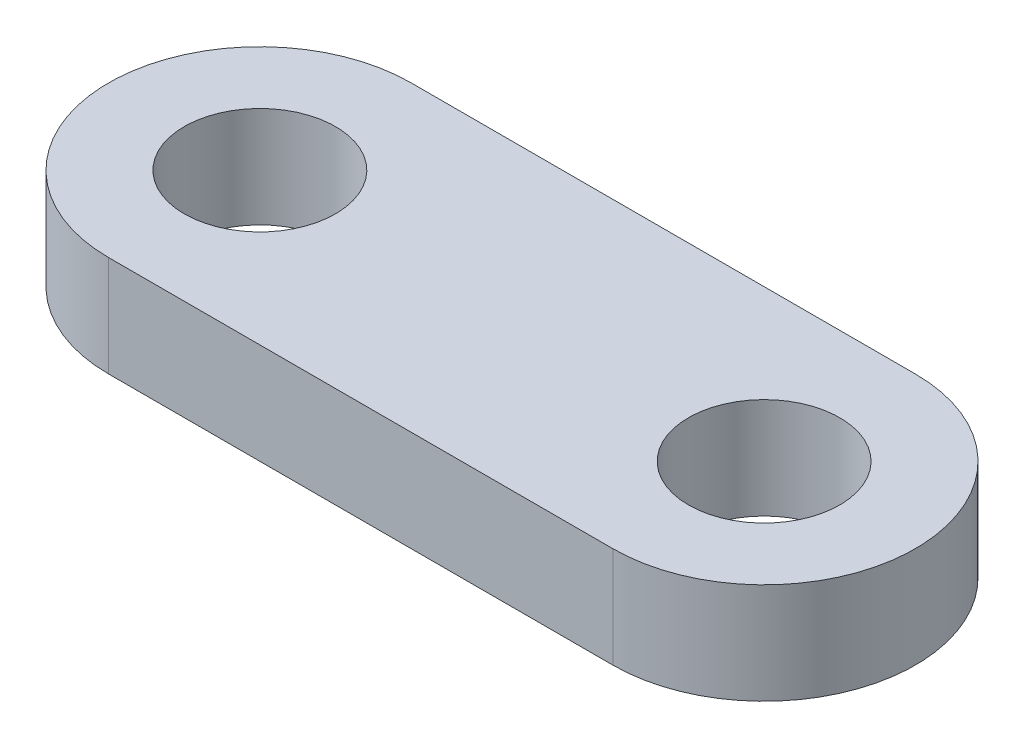
ISO-10303-21;
HEADER;
FILE_DESCRIPTION(('STEP AP214'),'2;1');
FILE_NAME('part.step','',(''),(''),'','','');
FILE_SCHEMA(('AUTOMOTIVE_DESIGN { 1 0 10303 214 1 1 1 1 }'));
ENDSEC;
DATA;
#1=APPLICATION_CONTEXT('core data for automotive mechanical design processes');
#2=APPLICATION_PROTOCOL_DEFINITION('international standard','automotive_design',2000,#1);
#3=PRODUCT_CONTEXT('',#1,'mechanical');
#4=PRODUCT('Part','Part','',(#3));
#5=PRODUCT_RELATED_PRODUCT_CATEGORY('part','',(#4));
#6=PRODUCT_DEFINITION_FORMATION('','',#4);
#7=PRODUCT_DEFINITION_CONTEXT('part definition',#1,'design');
#8=PRODUCT_DEFINITION('design','',#6,#7);
#9=PRODUCT_DEFINITION_SHAPE('','',#8);
#10=(LENGTH_UNIT() NAMED_UNIT(*) SI_UNIT(.MILLI.,.METRE.));
#11=(NAMED_UNIT(*) PLANE_ANGLE_UNIT() SI_UNIT($,.RADIAN.));
#12=(NAMED_UNIT(*) SI_UNIT($,.STERADIAN.) SOLID_ANGLE_UNIT());
#13=UNCERTAINTY_MEASURE_WITH_UNIT(LENGTH_MEASURE(1.E-05),#10,'distance_accuracy_value','');
#14=(GEOMETRIC_REPRESENTATION_CONTEXT(3) GLOBAL_UNCERTAINTY_ASSIGNED_CONTEXT((#13)) GLOBAL_UNIT_ASSIGNED_CONTEXT((#10,
#11,#12)) REPRESENTATION_CONTEXT('',''));
#15=CARTESIAN_POINT('',(0.,0.,0.));
#16=DIRECTION('',(0.,0.,1.));
#17=DIRECTION('',(1.,0.,0.));
#18=AXIS2_PLACEMENT_3D('',#15,#16,#17);
#19=CARTESIAN_POINT('',(-5.,1.,0.));
#20=DIRECTION('',(0.,1.,0.));
#21=DIRECTION('',(0.,0.,1.));
#22=AXIS2_PLACEMENT_3D('',#19,#20,#21);
#23=PLANE('',#22);
#24=CARTESIAN_POINT('',(-5.,1.,0.));
#25=DIRECTION('',(0.,1.,0.));
#26=DIRECTION('',(0.,0.,1.));
#27=AXIS2_PLACEMENT_3D('',#24,#25,#26);
#28=CIRCLE('',#27,1.5);
#29=CARTESIAN_POINT('',(-5.,1.,1.5));
#30=VERTEX_POINT('',#29);
#31=EDGE_CURVE('E101',#30,#30,#28,.T.);
#32=ORIENTED_EDGE('',*,*,#31,.F.);
#33=EDGE_LOOP('',(#32));
#34=FACE_BOUND('',#33,.T.);
#35=CARTESIAN_POINT('',(-5.,1.,0.));
#36=DIRECTION('',(0.,1.,0.));
#37=DIRECTION('',(0.,0.,1.));
#38=AXIS2_PLACEMENT_3D('',#35,#36,#37);
#39=CIRCLE('',#38,3.);
#40=CARTESIAN_POINT('',(-5.,1.,-3.));
#41=VERTEX_POINT('',#40);
#42=CARTESIAN_POINT('',(-5.,1.,3.));
#43=VERTEX_POINT('',#42);
#44=EDGE_CURVE('E86',#41,#43,#39,.T.);
#45=ORIENTED_EDGE('',*,*,#44,.T.);
#46=DIRECTION('',(1.,0.,0.));
#47=VECTOR('',#46,1.);
#48=CARTESIAN_POINT('',(-5.,1.,3.));
#49=LINE('',#48,#47);
#50=CARTESIAN_POINT('',(5.,1.,3.));
#51=VERTEX_POINT('',#50);
#52=EDGE_CURVE('E81',#43,#51,#49,.T.);
#53=ORIENTED_EDGE('',*,*,#52,.T.);
#54=CARTESIAN_POINT('',(5.,1.,0.));
#55=DIRECTION('',(0.,1.,0.));
#56=DIRECTION('',(0.,0.,1.));
#57=AXIS2_PLACEMENT_3D('',#54,#55,#56);
#58=CIRCLE('',#57,3.);
#59=CARTESIAN_POINT('',(5.,1.,-3.));
#60=VERTEX_POINT('',#59);
#61=EDGE_CURVE('E84',#51,#60,#58,.T.);
#62=ORIENTED_EDGE('',*,*,#61,.T.);
#63=DIRECTION('',(-1.,0.,0.));
#64=VECTOR('',#63,1.);
#65=CARTESIAN_POINT('',(-5.,1.,-3.));
#66=LINE('',#65,#64);
#67=EDGE_CURVE('E51',#60,#41,#66,.T.);
#68=ORIENTED_EDGE('',*,*,#67,.T.);
#69=EDGE_LOOP('',(#45,#53,#62,#68));
#70=FACE_BOUND('',#69,.T.);
#71=CARTESIAN_POINT('',(5.,1.,0.));
#72=DIRECTION('',(0.,1.,0.));
#73=DIRECTION('',(0.,0.,1.));
#74=AXIS2_PLACEMENT_3D('',#71,#72,#73);
#75=CIRCLE('',#74,1.5);
#76=CARTESIAN_POINT('',(5.,1.,1.5));
#77=VERTEX_POINT('',#76);
#78=EDGE_CURVE('E116',#77,#77,#75,.T.);
#79=ORIENTED_EDGE('',*,*,#78,.F.);
#80=EDGE_LOOP('',(#79));
#81=FACE_BOUND('',#80,.T.);
#82=ADVANCED_FACE('F34',(#34,#70,#81),#23,.T.);
#83=CARTESIAN_POINT('',(-5.,-1.,0.));
#84=DIRECTION('',(0.,1.,0.));
#85=DIRECTION('',(0.,0.,1.));
#86=AXIS2_PLACEMENT_3D('',#83,#84,#85);
#87=PLANE('',#86);
#88=CARTESIAN_POINT('',(-5.,-1.,0.));
#89=DIRECTION('',(0.,1.,0.));
#90=DIRECTION('',(0.,0.,1.));
#91=AXIS2_PLACEMENT_3D('',#88,#89,#90);
#92=CIRCLE('',#91,3.);
#93=CARTESIAN_POINT('',(-5.,-1.,-3.));
#94=VERTEX_POINT('',#93);
#95=CARTESIAN_POINT('',(-5.,-1.,3.));
#96=VERTEX_POINT('',#95);
#97=EDGE_CURVE('E98',#94,#96,#92,.T.);
#98=ORIENTED_EDGE('',*,*,#97,.F.);
#99=DIRECTION('',(-1.,0.,0.));
#100=VECTOR('',#99,1.);
#101=CARTESIAN_POINT('',(-5.,-1.,-3.));
#102=LINE('',#101,#100);
#103=CARTESIAN_POINT('',(5.,-1.,-3.));
#104=VERTEX_POINT('',#103);
#105=EDGE_CURVE('E74',#104,#94,#102,.T.);
#106=ORIENTED_EDGE('',*,*,#105,.F.);
#107=CARTESIAN_POINT('',(5.,-1.,0.));
#108=DIRECTION('',(0.,1.,0.));
#109=DIRECTION('',(0.,0.,1.));
#110=AXIS2_PLACEMENT_3D('',#107,#108,#109);
#111=CIRCLE('',#110,3.);
#112=CARTESIAN_POINT('',(5.,-1.,3.));
#113=VERTEX_POINT('',#112);
#114=EDGE_CURVE('E68',#113,#104,#111,.T.);
#115=ORIENTED_EDGE('',*,*,#114,.F.);
#116=DIRECTION('',(1.,0.,0.));
#117=VECTOR('',#116,1.);
#118=CARTESIAN_POINT('',(-5.,-1.,3.));
#119=LINE('',#118,#117);
#120=EDGE_CURVE('E90',#96,#113,#119,.T.);
#121=ORIENTED_EDGE('',*,*,#120,.F.);
#122=EDGE_LOOP('',(#98,#106,#115,#121));
#123=FACE_BOUND('',#122,.T.);
#124=CARTESIAN_POINT('',(-5.,-1.,0.));
#125=DIRECTION('',(0.,1.,0.));
#126=DIRECTION('',(0.,0.,1.));
#127=AXIS2_PLACEMENT_3D('',#124,#125,#126);
#128=CIRCLE('',#127,1.5);
#129=CARTESIAN_POINT('',(-5.,-1.,1.5));
#130=VERTEX_POINT('',#129);
#131=EDGE_CURVE('E113',#130,#130,#128,.T.);
#132=ORIENTED_EDGE('',*,*,#131,.T.);
#133=EDGE_LOOP('',(#132));
#134=FACE_BOUND('',#133,.T.);
#135=CARTESIAN_POINT('',(5.,-1.,0.));
#136=DIRECTION('',(0.,1.,0.));
#137=DIRECTION('',(0.,0.,1.));
#138=AXIS2_PLACEMENT_3D('',#135,#136,#137);
#139=CIRCLE('',#138,1.5);
#140=CARTESIAN_POINT('',(5.,-1.,1.5));
#141=VERTEX_POINT('',#140);
#142=EDGE_CURVE('E119',#141,#141,#139,.T.);
#143=ORIENTED_EDGE('',*,*,#142,.T.);
#144=EDGE_LOOP('',(#143));
#145=FACE_BOUND('',#144,.T.);
#146=ADVANCED_FACE('F109',(#123,#134,#145),#87,.F.);
#147=CARTESIAN_POINT('',(-5.,1.,0.));
#148=DIRECTION('',(0.,-1.,0.));
#149=DIRECTION('',(0.,0.,-1.));
#150=AXIS2_PLACEMENT_3D('',#147,#148,#149);
#151=CYLINDRICAL_SURFACE('',#150,3.);
#152=ORIENTED_EDGE('',*,*,#97,.T.);
#153=DIRECTION('',(0.,-1.,0.));
#154=VECTOR('',#153,1.);
#155=CARTESIAN_POINT('',(-5.,1.,3.));
#156=LINE('',#155,#154);
#157=EDGE_CURVE('E11',#43,#96,#156,.T.);
#158=ORIENTED_EDGE('',*,*,#157,.F.);
#159=ORIENTED_EDGE('',*,*,#44,.F.);
#160=DIRECTION('',(0.,-1.,0.));
#161=VECTOR('',#160,1.);
#162=CARTESIAN_POINT('',(-5.,1.,-3.));
#163=LINE('',#162,#161);
#164=EDGE_CURVE('E94',#41,#94,#163,.T.);
#165=ORIENTED_EDGE('',*,*,#164,.T.);
#166=EDGE_LOOP('',(#152,#158,#159,#165));
#167=FACE_BOUND('',#166,.T.);
#168=ADVANCED_FACE('F36',(#167),#151,.T.);
#169=CARTESIAN_POINT('',(-5.,1.,3.));
#170=DIRECTION('',(0.,0.,-1.));
#171=DIRECTION('',(-1.,0.,0.));
#172=AXIS2_PLACEMENT_3D('',#169,#170,#171);
#173=PLANE('',#172);
#174=ORIENTED_EDGE('',*,*,#120,.T.);
#175=DIRECTION('',(0.,-1.,0.));
#176=VECTOR('',#175,1.);
#177=CARTESIAN_POINT('',(5.,1.,3.));
#178=LINE('',#177,#176);
#179=EDGE_CURVE('E43',#51,#113,#178,.T.);
#180=ORIENTED_EDGE('',*,*,#179,.F.);
#181=ORIENTED_EDGE('',*,*,#52,.F.);
#182=ORIENTED_EDGE('',*,*,#157,.T.);
#183=EDGE_LOOP('',(#174,#180,#181,#182));
#184=FACE_BOUND('',#183,.T.);
#185=ADVANCED_FACE('F89',(#184),#173,.F.);
#186=CARTESIAN_POINT('',(5.,1.,0.));
#187=DIRECTION('',(0.,-1.,0.));
#188=DIRECTION('',(0.,0.,-1.));
#189=AXIS2_PLACEMENT_3D('',#186,#187,#188);
#190=CYLINDRICAL_SURFACE('',#189,3.);
#191=ORIENTED_EDGE('',*,*,#114,.T.);
#192=DIRECTION('',(0.,-1.,0.));
#193=VECTOR('',#192,1.);
#194=CARTESIAN_POINT('',(5.,1.,-3.));
#195=LINE('',#194,#193);
#196=EDGE_CURVE('E91',#60,#104,#195,.T.);
#197=ORIENTED_EDGE('',*,*,#196,.F.);
#198=ORIENTED_EDGE('',*,*,#61,.F.);
#199=ORIENTED_EDGE('',*,*,#179,.T.);
#200=EDGE_LOOP('',(#191,#197,#198,#199));
#201=FACE_BOUND('',#200,.T.);
#202=ADVANCED_FACE('F92',(#201),#190,.T.);
#203=CARTESIAN_POINT('',(-5.,1.,-3.));
#204=DIRECTION('',(0.,0.,1.));
#205=DIRECTION('',(1.,0.,0.));
#206=AXIS2_PLACEMENT_3D('',#203,#204,#205);
#207=PLANE('',#206);
#208=ORIENTED_EDGE('',*,*,#105,.T.);
#209=ORIENTED_EDGE('',*,*,#164,.F.);
#210=ORIENTED_EDGE('',*,*,#67,.F.);
#211=ORIENTED_EDGE('',*,*,#196,.T.);
#212=EDGE_LOOP('',(#208,#209,#210,#211));
#213=FACE_BOUND('',#212,.T.);
#214=ADVANCED_FACE('F106',(#213),#207,.F.);
#215=CARTESIAN_POINT('',(-5.,1.,0.));
#216=DIRECTION('',(0.,-1.,0.));
#217=DIRECTION('',(0.,0.,-1.));
#218=AXIS2_PLACEMENT_3D('',#215,#216,#217);
#219=CYLINDRICAL_SURFACE('',#218,1.5);
#220=ORIENTED_EDGE('',*,*,#31,.T.);
#221=EDGE_LOOP('',(#220));
#222=FACE_BOUND('',#221,.T.);
#223=ORIENTED_EDGE('',*,*,#131,.F.);
#224=EDGE_LOOP('',(#223));
#225=FACE_BOUND('',#224,.T.);
#226=ADVANCED_FACE('F136',(#222,#225),#219,.F.);
#227=CARTESIAN_POINT('',(5.,1.,0.));
#228=DIRECTION('',(0.,-1.,0.));
#229=DIRECTION('',(0.,0.,-1.));
#230=AXIS2_PLACEMENT_3D('',#227,#228,#229);
#231=CYLINDRICAL_SURFACE('',#230,1.5);
#232=ORIENTED_EDGE('',*,*,#78,.T.);
#233=EDGE_LOOP('',(#232));
#234=FACE_BOUND('',#233,.T.);
#235=ORIENTED_EDGE('',*,*,#142,.F.);
#236=EDGE_LOOP('',(#235));
#237=FACE_BOUND('',#236,.T.);
#238=ADVANCED_FACE('F125',(#234,#237),#231,.F.);
#239=CLOSED_SHELL('',(#82,#146,#168,#185,#202,#214,#226,#238));
#240=MANIFOLD_SOLID_BREP('B2',#239);
#241=ADVANCED_BREP_SHAPE_REPRESENTATION('',(#18,#240),#14);
#242=SHAPE_DEFINITION_REPRESENTATION(#9,#241);
ENDSEC;
END-ISO-10303-21;
